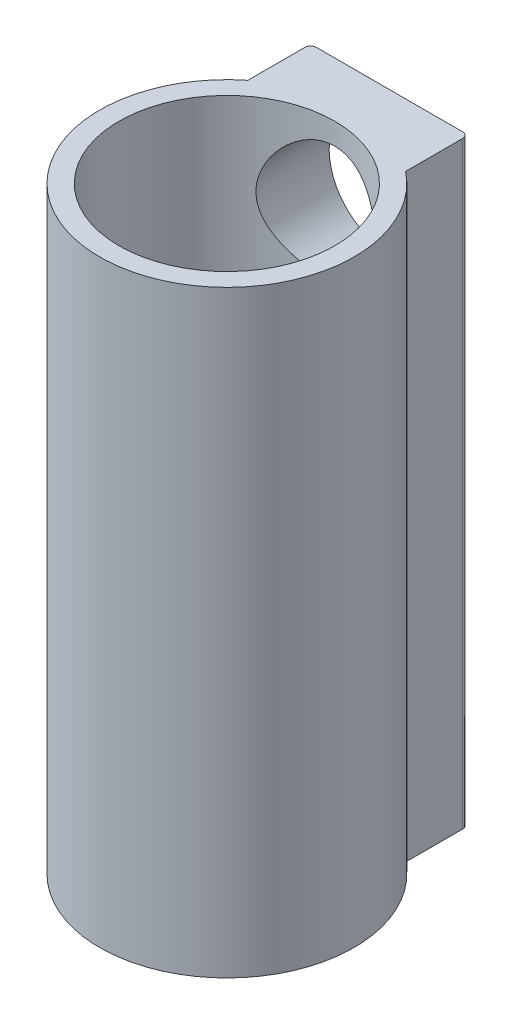
ISO-10303-21;
HEADER;
FILE_DESCRIPTION(('STEP AP214'),'2;1');
FILE_NAME('part.step','',(''),(''),'','','');
FILE_SCHEMA(('AUTOMOTIVE_DESIGN { 1 0 10303 214 1 1 1 1 }'));
ENDSEC;
DATA;
#1=APPLICATION_CONTEXT('core data for automotive mechanical design processes');
#2=APPLICATION_PROTOCOL_DEFINITION('international standard','automotive_design',2000,#1);
#3=PRODUCT_CONTEXT('',#1,'mechanical');
#4=PRODUCT('Part','Part','',(#3));
#5=PRODUCT_RELATED_PRODUCT_CATEGORY('part','',(#4));
#6=PRODUCT_DEFINITION_FORMATION('','',#4);
#7=PRODUCT_DEFINITION_CONTEXT('part definition',#1,'design');
#8=PRODUCT_DEFINITION('design','',#6,#7);
#9=PRODUCT_DEFINITION_SHAPE('','',#8);
#10=(LENGTH_UNIT() NAMED_UNIT(*) SI_UNIT(.MILLI.,.METRE.));
#11=(NAMED_UNIT(*) PLANE_ANGLE_UNIT() SI_UNIT($,.RADIAN.));
#12=(NAMED_UNIT(*) SI_UNIT($,.STERADIAN.) SOLID_ANGLE_UNIT());
#13=UNCERTAINTY_MEASURE_WITH_UNIT(LENGTH_MEASURE(1.E-05),#10,'distance_accuracy_value','');
#14=(GEOMETRIC_REPRESENTATION_CONTEXT(3) GLOBAL_UNCERTAINTY_ASSIGNED_CONTEXT((#13)) GLOBAL_UNIT_ASSIGNED_CONTEXT((#10,
#11,#12)) REPRESENTATION_CONTEXT('',''));
#15=CARTESIAN_POINT('',(0.,0.,0.));
#16=DIRECTION('',(0.,0.,1.));
#17=DIRECTION('',(1.,0.,0.));
#18=AXIS2_PLACEMENT_3D('',#15,#16,#17);
#19=CARTESIAN_POINT('',(-2.45,18.57,-3.09838667696593));
#20=DIRECTION('',(1.,0.,0.));
#21=DIRECTION('',(0.,0.,-1.));
#22=AXIS2_PLACEMENT_3D('',#19,#20,#21);
#23=PLANE('',#22);
#24=DIRECTION('',(0.,0.,1.));
#25=VECTOR('',#24,1.);
#26=CARTESIAN_POINT('',(-2.45,18.57,-3.09838667696593));
#27=LINE('',#26,#25);
#28=CARTESIAN_POINT('',(-2.45,18.57,-4.87));
#29=VERTEX_POINT('',#28);
#30=CARTESIAN_POINT('',(-2.45,18.57,-3.09838667696593));
#31=VERTEX_POINT('',#30);
#32=EDGE_CURVE('E97',#29,#31,#27,.T.);
#33=ORIENTED_EDGE('',*,*,#32,.F.);
#34=DIRECTION('',(0.,-1.,0.));
#35=VECTOR('',#34,1.);
#36=CARTESIAN_POINT('',(-2.45,18.57,-4.87));
#37=LINE('',#36,#35);
#38=CARTESIAN_POINT('',(-2.45,0.,-4.87));
#39=VERTEX_POINT('',#38);
#40=EDGE_CURVE('E13',#29,#39,#37,.T.);
#41=ORIENTED_EDGE('',*,*,#40,.T.);
#42=DIRECTION('',(0.,0.,1.));
#43=VECTOR('',#42,1.);
#44=CARTESIAN_POINT('',(-2.45,0.,-3.09838667696593));
#45=LINE('',#44,#43);
#46=CARTESIAN_POINT('',(-2.45,0.,-3.09838667696593));
#47=VERTEX_POINT('',#46);
#48=EDGE_CURVE('E116',#39,#47,#45,.T.);
#49=ORIENTED_EDGE('',*,*,#48,.T.);
#50=DIRECTION('',(0.,-1.,0.));
#51=VECTOR('',#50,1.);
#52=CARTESIAN_POINT('',(-2.45,18.57,-3.09838667696593));
#53=LINE('',#52,#51);
#54=EDGE_CURVE('E110',#31,#47,#53,.T.);
#55=ORIENTED_EDGE('',*,*,#54,.F.);
#56=EDGE_LOOP('',(#33,#41,#49,#55));
#57=FACE_BOUND('',#56,.T.);
#58=ADVANCED_FACE('F44',(#57),#23,.F.);
#59=CARTESIAN_POINT('',(0.,18.57,0.));
#60=DIRECTION('',(0.,-1.,0.));
#61=DIRECTION('',(0.,0.,-1.));
#62=AXIS2_PLACEMENT_3D('',#59,#60,#61);
#63=CYLINDRICAL_SURFACE('',#62,3.95);
#64=CARTESIAN_POINT('',(0.,0.,0.));
#65=DIRECTION('',(0.,1.,0.));
#66=DIRECTION('',(0.,0.,1.));
#67=AXIS2_PLACEMENT_3D('',#64,#65,#66);
#68=CIRCLE('',#67,3.95);
#69=CARTESIAN_POINT('',(2.45,0.,-3.09838667696593));
#70=VERTEX_POINT('',#69);
#71=EDGE_CURVE('E149',#47,#70,#68,.T.);
#72=ORIENTED_EDGE('',*,*,#71,.T.);
#73=DIRECTION('',(0.,-1.,0.));
#74=VECTOR('',#73,1.);
#75=CARTESIAN_POINT('',(2.45,18.57,-3.09838667696593));
#76=LINE('',#75,#74);
#77=CARTESIAN_POINT('',(2.45,18.57,-3.09838667696593));
#78=VERTEX_POINT('',#77);
#79=EDGE_CURVE('E112',#78,#70,#76,.T.);
#80=ORIENTED_EDGE('',*,*,#79,.F.);
#81=CARTESIAN_POINT('',(0.,18.57,0.));
#82=DIRECTION('',(0.,1.,0.));
#83=DIRECTION('',(0.,0.,1.));
#84=AXIS2_PLACEMENT_3D('',#81,#82,#83);
#85=CIRCLE('',#84,3.95);
#86=EDGE_CURVE('E100',#31,#78,#85,.T.);
#87=ORIENTED_EDGE('',*,*,#86,.F.);
#88=ORIENTED_EDGE('',*,*,#54,.T.);
#89=EDGE_LOOP('',(#72,#80,#87,#88));
#90=FACE_BOUND('',#89,.T.);
#91=ADVANCED_FACE('F109',(#90),#63,.T.);
#92=CARTESIAN_POINT('',(2.45,18.57,-3.09838667696593));
#93=DIRECTION('',(-1.,0.,0.));
#94=DIRECTION('',(0.,0.,1.));
#95=AXIS2_PLACEMENT_3D('',#92,#93,#94);
#96=PLANE('',#95);
#97=DIRECTION('',(0.,0.,-1.));
#98=VECTOR('',#97,1.);
#99=CARTESIAN_POINT('',(2.45,0.,-3.09838667696593));
#100=LINE('',#99,#98);
#101=CARTESIAN_POINT('',(2.45,0.,-4.87));
#102=VERTEX_POINT('',#101);
#103=EDGE_CURVE('E147',#70,#102,#100,.T.);
#104=ORIENTED_EDGE('',*,*,#103,.T.);
#105=DIRECTION('',(0.,-1.,0.));
#106=VECTOR('',#105,1.);
#107=CARTESIAN_POINT('',(2.45,18.57,-4.87));
#108=LINE('',#107,#106);
#109=CARTESIAN_POINT('',(2.45,18.57,-4.87));
#110=VERTEX_POINT('',#109);
#111=EDGE_CURVE('E67',#102,#110,#108,.F.);
#112=ORIENTED_EDGE('',*,*,#111,.T.);
#113=DIRECTION('',(0.,0.,-1.));
#114=VECTOR('',#113,1.);
#115=CARTESIAN_POINT('',(2.45,18.57,-3.09838667696593));
#116=LINE('',#115,#114);
#117=EDGE_CURVE('E113',#78,#110,#116,.T.);
#118=ORIENTED_EDGE('',*,*,#117,.F.);
#119=ORIENTED_EDGE('',*,*,#79,.T.);
#120=EDGE_LOOP('',(#104,#112,#118,#119));
#121=FACE_BOUND('',#120,.T.);
#122=ADVANCED_FACE('F148',(#121),#96,.F.);
#123=CARTESIAN_POINT('',(2.45,18.57,-5.05));
#124=DIRECTION('',(0.,0.,1.));
#125=DIRECTION('',(1.,0.,0.));
#126=AXIS2_PLACEMENT_3D('',#123,#124,#125);
#127=PLANE('',#126);
#128=CARTESIAN_POINT('',(0.,16.025,-5.05));
#129=DIRECTION('',(0.,0.,-1.));
#130=DIRECTION('',(-1.,0.,0.));
#131=AXIS2_PLACEMENT_3D('',#128,#129,#130);
#132=CIRCLE('',#131,1.875);
#133=CARTESIAN_POINT('',(-1.875,16.025,-5.05));
#134=VERTEX_POINT('',#133);
#135=EDGE_CURVE('E170',#134,#134,#132,.T.);
#136=ORIENTED_EDGE('',*,*,#135,.F.);
#137=EDGE_LOOP('',(#136));
#138=FACE_BOUND('',#137,.T.);
#139=CARTESIAN_POINT('',(0.,3.075,-5.05));
#140=DIRECTION('',(0.,0.,-1.));
#141=DIRECTION('',(-1.,0.,0.));
#142=AXIS2_PLACEMENT_3D('',#139,#140,#141);
#143=CIRCLE('',#142,1.875);
#144=CARTESIAN_POINT('',(-1.875,3.075,-5.05));
#145=VERTEX_POINT('',#144);
#146=EDGE_CURVE('E171',#145,#145,#143,.T.);
#147=ORIENTED_EDGE('',*,*,#146,.F.);
#148=EDGE_LOOP('',(#147));
#149=FACE_BOUND('',#148,.T.);
#150=DIRECTION('',(-1.,0.,0.));
#151=VECTOR('',#150,1.);
#152=CARTESIAN_POINT('',(2.45,18.57,-5.05));
#153=LINE('',#152,#151);
#154=CARTESIAN_POINT('',(2.27,18.57,-5.05));
#155=VERTEX_POINT('',#154);
#156=CARTESIAN_POINT('',(-2.27,18.57,-5.05));
#157=VERTEX_POINT('',#156);
#158=EDGE_CURVE('E122',#155,#157,#153,.T.);
#159=ORIENTED_EDGE('',*,*,#158,.F.);
#160=DIRECTION('',(0.,-1.,0.));
#161=VECTOR('',#160,1.);
#162=CARTESIAN_POINT('',(2.27,18.57,-5.05));
#163=LINE('',#162,#161);
#164=CARTESIAN_POINT('',(2.27,0.,-5.05));
#165=VERTEX_POINT('',#164);
#166=EDGE_CURVE('E120',#155,#165,#163,.T.);
#167=ORIENTED_EDGE('',*,*,#166,.T.);
#168=DIRECTION('',(-1.,0.,0.));
#169=VECTOR('',#168,1.);
#170=CARTESIAN_POINT('',(2.45,0.,-5.05));
#171=LINE('',#170,#169);
#172=CARTESIAN_POINT('',(-2.27,0.,-5.05));
#173=VERTEX_POINT('',#172);
#174=EDGE_CURVE('E105',#165,#173,#171,.T.);
#175=ORIENTED_EDGE('',*,*,#174,.T.);
#176=DIRECTION('',(0.,-1.,0.));
#177=VECTOR('',#176,1.);
#178=CARTESIAN_POINT('',(-2.27,18.57,-5.05));
#179=LINE('',#178,#177);
#180=EDGE_CURVE('E118',#173,#157,#179,.F.);
#181=ORIENTED_EDGE('',*,*,#180,.T.);
#182=EDGE_LOOP('',(#159,#167,#175,#181));
#183=FACE_BOUND('',#182,.T.);
#184=ADVANCED_FACE('F138',(#138,#149,#183),#127,.F.);
#185=CARTESIAN_POINT('',(0.,18.57,0.));
#186=DIRECTION('',(0.,1.,0.));
#187=DIRECTION('',(0.,0.,1.));
#188=AXIS2_PLACEMENT_3D('',#185,#186,#187);
#189=PLANE('',#188);
#190=CARTESIAN_POINT('',(0.,18.57,0.));
#191=DIRECTION('',(0.,-1.,0.));
#192=DIRECTION('',(0.,0.,-1.));
#193=AXIS2_PLACEMENT_3D('',#190,#191,#192);
#194=CIRCLE('',#193,3.35);
#195=CARTESIAN_POINT('',(0.,18.57,-3.35));
#196=VERTEX_POINT('',#195);
#197=EDGE_CURVE('E153',#196,#196,#194,.T.);
#198=ORIENTED_EDGE('',*,*,#197,.T.);
#199=EDGE_LOOP('',(#198));
#200=FACE_BOUND('',#199,.T.);
#201=ORIENTED_EDGE('',*,*,#117,.T.);
#202=CARTESIAN_POINT('',(2.27,18.57,-4.87));
#203=DIRECTION('',(0.,1.,0.));
#204=DIRECTION('',(0.,0.,1.));
#205=AXIS2_PLACEMENT_3D('',#202,#203,#204);
#206=CIRCLE('',#205,0.18);
#207=EDGE_CURVE('E52',#110,#155,#206,.T.);
#208=ORIENTED_EDGE('',*,*,#207,.T.);
#209=ORIENTED_EDGE('',*,*,#158,.T.);
#210=CARTESIAN_POINT('',(-2.27,18.57,-4.87));
#211=DIRECTION('',(0.,1.,0.));
#212=DIRECTION('',(0.,0.,1.));
#213=AXIS2_PLACEMENT_3D('',#210,#211,#212);
#214=CIRCLE('',#213,0.18);
#215=EDGE_CURVE('E59',#157,#29,#214,.T.);
#216=ORIENTED_EDGE('',*,*,#215,.T.);
#217=ORIENTED_EDGE('',*,*,#32,.T.);
#218=ORIENTED_EDGE('',*,*,#86,.T.);
#219=EDGE_LOOP('',(#201,#208,#209,#216,#217,#218));
#220=FACE_BOUND('',#219,.T.);
#221=ADVANCED_FACE('F99',(#200,#220),#189,.T.);
#222=CARTESIAN_POINT('',(0.,0.,0.));
#223=DIRECTION('',(0.,1.,0.));
#224=DIRECTION('',(0.,0.,1.));
#225=AXIS2_PLACEMENT_3D('',#222,#223,#224);
#226=PLANE('',#225);
#227=CARTESIAN_POINT('',(0.,0.,0.));
#228=DIRECTION('',(0.,-1.,0.));
#229=DIRECTION('',(0.,0.,-1.));
#230=AXIS2_PLACEMENT_3D('',#227,#228,#229);
#231=CIRCLE('',#230,3.35);
#232=CARTESIAN_POINT('',(0.,0.,-3.35));
#233=VERTEX_POINT('',#232);
#234=EDGE_CURVE('E156',#233,#233,#231,.T.);
#235=ORIENTED_EDGE('',*,*,#234,.F.);
#236=EDGE_LOOP('',(#235));
#237=FACE_BOUND('',#236,.T.);
#238=ORIENTED_EDGE('',*,*,#174,.F.);
#239=CARTESIAN_POINT('',(2.27,0.,-4.87));
#240=DIRECTION('',(0.,1.,0.));
#241=DIRECTION('',(0.,0.,1.));
#242=AXIS2_PLACEMENT_3D('',#239,#240,#241);
#243=CIRCLE('',#242,0.18);
#244=EDGE_CURVE('E130',#165,#102,#243,.F.);
#245=ORIENTED_EDGE('',*,*,#244,.T.);
#246=ORIENTED_EDGE('',*,*,#103,.F.);
#247=ORIENTED_EDGE('',*,*,#71,.F.);
#248=ORIENTED_EDGE('',*,*,#48,.F.);
#249=CARTESIAN_POINT('',(-2.27,0.,-4.87));
#250=DIRECTION('',(0.,1.,0.));
#251=DIRECTION('',(0.,0.,1.));
#252=AXIS2_PLACEMENT_3D('',#249,#250,#251);
#253=CIRCLE('',#252,0.18);
#254=EDGE_CURVE('E128',#39,#173,#253,.F.);
#255=ORIENTED_EDGE('',*,*,#254,.T.);
#256=EDGE_LOOP('',(#238,#245,#246,#247,#248,#255));
#257=FACE_BOUND('',#256,.T.);
#258=ADVANCED_FACE('F146',(#237,#257),#226,.F.);
#259=CARTESIAN_POINT('',(0.,18.57,0.));
#260=DIRECTION('',(0.,-1.,0.));
#261=DIRECTION('',(0.,0.,-1.));
#262=AXIS2_PLACEMENT_3D('',#259,#260,#261);
#263=CYLINDRICAL_SURFACE('',#262,3.35);
#264=CARTESIAN_POINT('',(-1.875,16.025,-2.7761258977215));
#265=CARTESIAN_POINT('',(-1.87499287234124,15.9292399946441,-2.77613604271632));
#266=CARTESIAN_POINT('',(-1.86761267461893,15.8334044136909,-2.78115963988623));
#267=CARTESIAN_POINT('',(-1.83854256740093,15.6448321491257,-2.80045421733537));
#268=CARTESIAN_POINT('',(-1.81682956250123,15.5521007212598,-2.81474012192323));
#269=CARTESIAN_POINT('',(-1.76042665095933,15.3728489401913,-2.85034930223412));
#270=CARTESIAN_POINT('',(-1.72582028627443,15.2862927859383,-2.87162717128924));
#271=CARTESIAN_POINT('',(-1.64487018670744,15.1202517871392,-2.91874809573255));
#272=CARTESIAN_POINT('',(-1.59852373227179,15.0407685867925,-2.94459220845604));
#273=CARTESIAN_POINT('',(-1.48972492206994,14.8819532799263,-3.00122618758486));
#274=CARTESIAN_POINT('',(-1.4260926214377,14.8035127986897,-3.03225044225055));
#275=CARTESIAN_POINT('',(-1.28696197153897,14.6576969853041,-3.09386862190123));
#276=CARTESIAN_POINT('',(-1.21145629037722,14.5903285431369,-3.12446226817974));
#277=CARTESIAN_POINT('',(-1.04246708746002,14.4626044557342,-3.18504538766868));
#278=CARTESIAN_POINT('',(-0.947977827899072,14.4034227247525,-3.21473360948961));
#279=CARTESIAN_POINT('',(-0.74840712581996,14.3022121437557,-3.26695429868513));
#280=CARTESIAN_POINT('',(-0.643334123670864,14.2601697583426,-3.28949240956049));
#281=CARTESIAN_POINT('',(-0.435088341998919,14.1982290182908,-3.32315407013514));
#282=CARTESIAN_POINT('',(-0.332521870035013,14.17674406909,-3.33508911917608));
#283=CARTESIAN_POINT('',(-0.12460917645752,14.1512227175356,-3.34929800714653));
#284=CARTESIAN_POINT('',(-0.0192652213762388,14.1471725056551,-3.35157949234683));
#285=CARTESIAN_POINT('',(0.178939956514119,14.1562118257769,-3.34652669901919));
#286=CARTESIAN_POINT('',(0.271917145503595,14.167492083642,-3.34020735374713));
#287=CARTESIAN_POINT('',(0.454404098691081,14.2035192713013,-3.32030744999151));
#288=CARTESIAN_POINT('',(0.543913594267292,14.2282672421344,-3.30672633018241));
#289=CARTESIAN_POINT('',(0.718151215104206,14.2904874529761,-3.27333395690849));
#290=CARTESIAN_POINT('',(0.802822867890616,14.3280839167729,-3.25346202532822));
#291=CARTESIAN_POINT('',(0.964810256157397,14.4146554124777,-3.20915920335101));
#292=CARTESIAN_POINT('',(1.04212370327371,14.4636339679645,-3.18472690165237));
#293=CARTESIAN_POINT('',(1.19632203331535,14.5777182599567,-3.13028957854549));
#294=CARTESIAN_POINT('',(1.27221968266143,14.644006752267,-3.09996713845928));
#295=CARTESIAN_POINT('',(1.41241235611126,14.7877398520473,-3.03866062761939));
#296=CARTESIAN_POINT('',(1.47669469801166,14.865196489615,-3.00767587448992));
#297=CARTESIAN_POINT('',(1.59781246099716,15.037714137814,-2.94525968342902));
#298=CARTESIAN_POINT('',(1.65340041284101,15.1337422557,-2.91405439715585));
#299=CARTESIAN_POINT('',(1.74727968827851,15.3357910651668,-2.85875902397525));
#300=CARTESIAN_POINT('',(1.78559105484102,15.4418000042045,-2.8346607034053));
#301=CARTESIAN_POINT('',(1.84049587872024,15.6521257480937,-2.79929862472406));
#302=CARTESIAN_POINT('',(1.8585835691843,15.7558975117307,-2.78716118283281));
#303=CARTESIAN_POINT('',(1.87700517143831,15.9656563846335,-2.7747968090415));
#304=CARTESIAN_POINT('',(1.87736147090592,16.0716405312925,-2.77455485788382));
#305=CARTESIAN_POINT('',(1.86167504125771,16.2653348705671,-2.78508716881366));
#306=CARTESIAN_POINT('',(1.84813449907688,16.3533587114852,-2.79418062254539));
#307=CARTESIAN_POINT('',(1.80908996523321,16.5256221206083,-2.81961570594117));
#308=CARTESIAN_POINT('',(1.78358033631749,16.6098598851227,-2.83596075079366));
#309=CARTESIAN_POINT('',(1.72035149716227,16.7761696228995,-2.87477151795574));
#310=CARTESIAN_POINT('',(1.68217957797378,16.8580156547221,-2.8974583475699));
#311=CARTESIAN_POINT('',(1.59508410575663,17.0146315287777,-2.94630266294992));
#312=CARTESIAN_POINT('',(1.54615536493574,17.0893979316746,-2.97246182092755));
#313=CARTESIAN_POINT('',(1.42954734509148,17.2426863620049,-3.03047826864614));
#314=CARTESIAN_POINT('',(1.36010576060986,17.3197881000428,-3.06256294177509));
#315=CARTESIAN_POINT('',(1.20908240078032,17.4618363611147,-3.12526965225309));
#316=CARTESIAN_POINT('',(1.12749289199684,17.5267750812054,-3.155890741352));
#317=CARTESIAN_POINT('',(0.94863365803335,17.6460812864739,-3.2143308878617));
#318=CARTESIAN_POINT('',(0.850739806581799,17.6996479309958,-3.24189518586643));
#319=CARTESIAN_POINT('',(0.64536125388333,17.7889828557287,-3.28893031363674));
#320=CARTESIAN_POINT('',(0.537886928643037,17.8247701219622,-3.30840977326397));
#321=CARTESIAN_POINT('',(0.328344172587634,17.8738296276856,-3.33536732019795));
#322=CARTESIAN_POINT('',(0.226864925530601,17.8890464766686,-3.34387764967024));
#323=CARTESIAN_POINT('',(0.0224527849355661,17.9026564375613,-3.35148199003504));
#324=CARTESIAN_POINT('',(-0.08047924674185,17.901059137393,-3.35058136733117));
#325=CARTESIAN_POINT('',(-0.274529021484194,17.8821109487035,-3.34001326511986));
#326=CARTESIAN_POINT('',(-0.365845450908251,17.8662599944197,-3.3311806018789));
#327=CARTESIAN_POINT('',(-0.544287309477157,17.8216182827033,-3.3067150254572));
#328=CARTESIAN_POINT('',(-0.631412253865557,17.7928260325388,-3.29108132780834));
#329=CARTESIAN_POINT('',(-0.802216072257606,17.7223173358631,-3.25374240952938));
#330=CARTESIAN_POINT('',(-0.885697159510274,17.6802188954737,-3.23185986882412));
#331=CARTESIAN_POINT('',(-1.04466557367176,17.5847771738179,-3.18403443585199));
#332=CARTESIAN_POINT('',(-1.12014979793316,17.5314295518906,-3.15808997723283));
#333=CARTESIAN_POINT('',(-1.27040330447954,17.4078389832538,-3.10093027046846));
#334=CARTESIAN_POINT('',(-1.34404763647409,17.3363476524596,-3.06945384618608));
#335=CARTESIAN_POINT('',(-1.47888007123464,17.1821699554585,-3.00681797013082));
#336=CARTESIAN_POINT('',(-1.540052203242,17.0994694584975,-2.97565897270394));
#337=CARTESIAN_POINT('',(-1.65255925655133,16.9177088831284,-2.91477840407649));
#338=CARTESIAN_POINT('',(-1.70283240520757,16.8178913168632,-2.88533345783522));
#339=CARTESIAN_POINT('',(-1.78519263240506,16.609127866611,-2.83512815565036));
#340=CARTESIAN_POINT('',(-1.81733639021256,16.5002116682877,-2.81434078679155));
#341=CARTESIAN_POINT('',(-1.85118137051215,16.3290607521256,-2.79209796549489));
#342=CARTESIAN_POINT('',(-1.86008889975787,16.268759184453,-2.78614797693979));
#343=CARTESIAN_POINT('',(-1.8720002554452,16.1473153133024,-2.77815885878835));
#344=CARTESIAN_POINT('',(-1.87500455326646,16.0861730773455,-2.77611941693079));
#345=CARTESIAN_POINT('',(-1.875,16.025,-2.7761258977215));
#346=B_SPLINE_CURVE_WITH_KNOTS('',3,(#264,#265,#266,#267,#268,#269,#270,#271,#272,#273,#274,
#275,#276,#277,#278,#279,#280,#281,#282,#283,#284,#285,#286,#287,#288,#289,#290,#291,#292,#293,
#294,#295,#296,#297,#298,#299,#300,#301,#302,#303,#304,#305,#306,#307,#308,#309,#310,#311,#312,
#313,#314,#315,#316,#317,#318,#319,#320,#321,#322,#323,#324,#325,#326,#327,#328,#329,#330,#331,
#332,#333,#334,#335,#336,#337,#338,#339,#340,#341,#342,#343,#344,#345),.UNSPECIFIED.,.T.,.F.,(4,
2,2,2,2,2,2,2,2,2,2,2,2,2,2,2,2,2,2,2,2,2,2,2,2,2,2,2,2,2,2,2,2,2,2,2,2,2,2,2,4),(0.,
0.287019578405243,0.574502783211287,0.860154762370176,1.1458729724876,1.46158240125529,
1.77748755394181,2.12177591712249,2.46579185743069,2.7803801644458,3.09471924969862,
3.37500488985358,3.65531219884951,3.93841011062371,4.221595778652,4.53600646776053,
4.85075839951227,5.1947648623367,5.53837120202622,5.85444508588683,6.17011988430658,
6.43746783252475,6.70494182404048,6.98325017547482,7.26169304486107,7.58613820764798,
7.91079080418176,8.25371851921521,8.59627924145493,8.90343782594904,9.21042126908519,
9.48845298263753,9.76651677437891,10.0534260105275,10.3404461580473,10.6611723564728,
10.9823067032846,11.3271852760873,11.6709795661231,11.8543470689637,12.0376999291082),.UNSPECIFIED.);
#347=CARTESIAN_POINT('',(-1.875,16.025,-2.7761258977215));
#348=VERTEX_POINT('',#347);
#349=EDGE_CURVE('E159',#348,#348,#346,.T.);
#350=ORIENTED_EDGE('',*,*,#349,.F.);
#351=EDGE_LOOP('',(#350));
#352=FACE_BOUND('',#351,.T.);
#353=CARTESIAN_POINT('',(-1.875,3.075,-2.7761258977215));
#354=CARTESIAN_POINT('',(-1.87499287234124,2.97923999464414,-2.77613604271632));
#355=CARTESIAN_POINT('',(-1.86761267461892,2.88340441369092,-2.78115963988623));
#356=CARTESIAN_POINT('',(-1.83854256740093,2.69483214912566,-2.80045421733538));
#357=CARTESIAN_POINT('',(-1.81682956250123,2.60210072125979,-2.81474012192323));
#358=CARTESIAN_POINT('',(-1.76042665095932,2.42284894019133,-2.85034930223412));
#359=CARTESIAN_POINT('',(-1.72582028627443,2.33629278593826,-2.87162717128924));
#360=CARTESIAN_POINT('',(-1.64487018670743,2.17025178713919,-2.91874809573256));
#361=CARTESIAN_POINT('',(-1.59852373227178,2.09076858679255,-2.94459220845604));
#362=CARTESIAN_POINT('',(-1.48972492206994,1.93195327992626,-3.00122618758486));
#363=CARTESIAN_POINT('',(-1.4260926214377,1.85351279868973,-3.03225044225055));
#364=CARTESIAN_POINT('',(-1.28696197153896,1.70769698530412,-3.09386862190123));
#365=CARTESIAN_POINT('',(-1.21145629037722,1.64032854313686,-3.12446226817974));
#366=CARTESIAN_POINT('',(-1.04246708746001,1.51260445573419,-3.18504538766868));
#367=CARTESIAN_POINT('',(-0.947977827899071,1.45342272475255,-3.21473360948961));
#368=CARTESIAN_POINT('',(-0.748407125819959,1.35221214375572,-3.26695429868514));
#369=CARTESIAN_POINT('',(-0.643334123670863,1.31016975834263,-3.28949240956049));
#370=CARTESIAN_POINT('',(-0.435088341998917,1.2482290182908,-3.32315407013514));
#371=CARTESIAN_POINT('',(-0.332521870035011,1.22674406909001,-3.33508911917608));
#372=CARTESIAN_POINT('',(-0.124609176457519,1.20122271753559,-3.34929800714653));
#373=CARTESIAN_POINT('',(-0.0192652213762379,1.19717250565514,-3.35157949234683));
#374=CARTESIAN_POINT('',(0.17893995651412,1.2062118257769,-3.34652669901919));
#375=CARTESIAN_POINT('',(0.271917145503596,1.21749208364205,-3.34020735374713));
#376=CARTESIAN_POINT('',(0.454404098691082,1.25351927130131,-3.32030744999151));
#377=CARTESIAN_POINT('',(0.543913594267292,1.27826724213439,-3.30672633018241));
#378=CARTESIAN_POINT('',(0.718151215104206,1.34048745297612,-3.27333395690849));
#379=CARTESIAN_POINT('',(0.802822867890616,1.37808391677292,-3.25346202532822));
#380=CARTESIAN_POINT('',(0.964810256157398,1.46465541247774,-3.20915920335101));
#381=CARTESIAN_POINT('',(1.04212370327371,1.51363396796447,-3.18472690165237));
#382=CARTESIAN_POINT('',(1.19632203331535,1.62771825995671,-3.13028957854549));
#383=CARTESIAN_POINT('',(1.27221968266143,1.69400675226704,-3.09996713845928));
#384=CARTESIAN_POINT('',(1.41241235611126,1.83773985204733,-3.03866062761939));
#385=CARTESIAN_POINT('',(1.47669469801165,1.91519648961503,-3.00767587448992));
#386=CARTESIAN_POINT('',(1.59781246099715,2.08771413781399,-2.94525968342903));
#387=CARTESIAN_POINT('',(1.65340041284101,2.18374225569997,-2.91405439715585));
#388=CARTESIAN_POINT('',(1.74727968827851,2.38579106516683,-2.85875902397525));
#389=CARTESIAN_POINT('',(1.78559105484102,2.49180000420449,-2.8346607034053));
#390=CARTESIAN_POINT('',(1.84049587872024,2.7021257480937,-2.79929862472406));
#391=CARTESIAN_POINT('',(1.85858356918429,2.80589751173074,-2.78716118283281));
#392=CARTESIAN_POINT('',(1.87700517143831,3.01565638463354,-2.7747968090415));
#393=CARTESIAN_POINT('',(1.87736147090592,3.12164053129251,-2.77455485788382));
#394=CARTESIAN_POINT('',(1.86167504125771,3.31533487056715,-2.78508716881366));
#395=CARTESIAN_POINT('',(1.84813449907688,3.40335871148524,-2.79418062254539));
#396=CARTESIAN_POINT('',(1.8090899652332,3.57562212060828,-2.81961570594117));
#397=CARTESIAN_POINT('',(1.78358033631749,3.65985988512275,-2.83596075079366));
#398=CARTESIAN_POINT('',(1.72035149716226,3.82616962289955,-2.87477151795574));
#399=CARTESIAN_POINT('',(1.68217957797378,3.9080156547221,-2.89745834756991));
#400=CARTESIAN_POINT('',(1.59508410575662,4.06463152877775,-2.94630266294992));
#401=CARTESIAN_POINT('',(1.54615536493574,4.13939793167461,-2.97246182092755));
#402=CARTESIAN_POINT('',(1.42954734509147,4.29268636200487,-3.03047826864615));
#403=CARTESIAN_POINT('',(1.36010576060986,4.36978810004279,-3.06256294177509));
#404=CARTESIAN_POINT('',(1.20908240078031,4.51183636111472,-3.12526965225309));
#405=CARTESIAN_POINT('',(1.12749289199683,4.57677508120537,-3.155890741352));
#406=CARTESIAN_POINT('',(0.948633658033347,4.69608128647386,-3.2143308878617));
#407=CARTESIAN_POINT('',(0.850739806581797,4.74964793099578,-3.24189518586643));
#408=CARTESIAN_POINT('',(0.645361253883329,4.8389828557287,-3.28893031363674));
#409=CARTESIAN_POINT('',(0.537886928643035,4.87477012196221,-3.30840977326397));
#410=CARTESIAN_POINT('',(0.328344172587631,4.92382962768559,-3.33536732019795));
#411=CARTESIAN_POINT('',(0.226864925530598,4.93904647666861,-3.34387764967024));
#412=CARTESIAN_POINT('',(0.0224527849355631,4.95265643756133,-3.35148199003504));
#413=CARTESIAN_POINT('',(-0.0804792467418523,4.95105913739295,-3.35058136733117));
#414=CARTESIAN_POINT('',(-0.274529021484195,4.93211094870346,-3.34001326511986));
#415=CARTESIAN_POINT('',(-0.365845450908251,4.91625999441972,-3.3311806018789));
#416=CARTESIAN_POINT('',(-0.544287309477156,4.87161828270332,-3.3067150254572));
#417=CARTESIAN_POINT('',(-0.631412253865557,4.84282603253883,-3.29108132780834));
#418=CARTESIAN_POINT('',(-0.802216072257607,4.77231733586309,-3.25374240952938));
#419=CARTESIAN_POINT('',(-0.885697159510274,4.73021889547367,-3.23185986882412));
#420=CARTESIAN_POINT('',(-1.04466557367176,4.63477717381794,-3.18403443585199));
#421=CARTESIAN_POINT('',(-1.12014979793316,4.58142955189062,-3.15808997723283));
#422=CARTESIAN_POINT('',(-1.27040330447954,4.45783898325377,-3.10093027046846));
#423=CARTESIAN_POINT('',(-1.34404763647409,4.38634765245955,-3.06945384618608));
#424=CARTESIAN_POINT('',(-1.47888007123464,4.23216995545848,-3.00681797013082));
#425=CARTESIAN_POINT('',(-1.540052203242,4.14946945849748,-2.97565897270394));
#426=CARTESIAN_POINT('',(-1.65255925655133,3.96770888312837,-2.91477840407649));
#427=CARTESIAN_POINT('',(-1.70283240520757,3.86789131686323,-2.88533345783522));
#428=CARTESIAN_POINT('',(-1.78519263240506,3.65912786661103,-2.83512815565036));
#429=CARTESIAN_POINT('',(-1.81733639021256,3.55021166828765,-2.81434078679156));
#430=CARTESIAN_POINT('',(-1.85118137051215,3.37906075212562,-2.79209796549489));
#431=CARTESIAN_POINT('',(-1.86008889975786,3.31875918445297,-2.78614797693979));
#432=CARTESIAN_POINT('',(-1.87200025544519,3.19731531330242,-2.77815885878835));
#433=CARTESIAN_POINT('',(-1.87500455326646,3.13617307734547,-2.77611941693079));
#434=CARTESIAN_POINT('',(-1.875,3.075,-2.7761258977215));
#435=B_SPLINE_CURVE_WITH_KNOTS('',3,(#353,#354,#355,#356,#357,#358,#359,#360,#361,#362,#363,
#364,#365,#366,#367,#368,#369,#370,#371,#372,#373,#374,#375,#376,#377,#378,#379,#380,#381,#382,
#383,#384,#385,#386,#387,#388,#389,#390,#391,#392,#393,#394,#395,#396,#397,#398,#399,#400,#401,
#402,#403,#404,#405,#406,#407,#408,#409,#410,#411,#412,#413,#414,#415,#416,#417,#418,#419,#420,
#421,#422,#423,#424,#425,#426,#427,#428,#429,#430,#431,#432,#433,#434),.UNSPECIFIED.,.T.,.F.,(4,
2,2,2,2,2,2,2,2,2,2,2,2,2,2,2,2,2,2,2,2,2,2,2,2,2,2,2,2,2,2,2,2,2,2,2,2,2,2,2,4),(0.,
0.287019578405241,0.574502783211286,0.860154762370174,1.1458729724876,1.46158240125529,
1.77748755394181,2.12177591712249,2.46579185743069,2.78038016444579,3.09471924969861,
3.37500488985358,3.65531219884951,3.93841011062371,4.221595778652,4.53600646776053,
4.85075839951227,5.1947648623367,5.53837120202621,5.85444508588683,6.17011988430658,
6.43746783252475,6.70494182404048,6.98325017547481,7.26169304486106,7.58613820764797,
7.91079080418176,8.2537185192152,8.59627924145492,8.90343782594903,9.21042126908518,
9.48845298263752,9.7665167743789,10.0534260105275,10.3404461580472,10.6611723564728,
10.9823067032846,11.3271852760872,11.6709795661231,11.8543470689637,12.0376999291082),.UNSPECIFIED.);
#436=CARTESIAN_POINT('',(-1.875,3.075,-2.7761258977215));
#437=VERTEX_POINT('',#436);
#438=EDGE_CURVE('E162',#437,#437,#435,.T.);
#439=ORIENTED_EDGE('',*,*,#438,.F.);
#440=EDGE_LOOP('',(#439));
#441=FACE_BOUND('',#440,.T.);
#442=ORIENTED_EDGE('',*,*,#197,.F.);
#443=EDGE_LOOP('',(#442));
#444=FACE_BOUND('',#443,.T.);
#445=ORIENTED_EDGE('',*,*,#234,.T.);
#446=EDGE_LOOP('',(#445));
#447=FACE_BOUND('',#446,.T.);
#448=ADVANCED_FACE('F200',(#352,#441,#444,#447),#263,.F.);
#449=CARTESIAN_POINT('',(0.,3.075,3.951));
#450=DIRECTION('',(0.,0.,-1.));
#451=DIRECTION('',(-1.,0.,0.));
#452=AXIS2_PLACEMENT_3D('',#449,#450,#451);
#453=CYLINDRICAL_SURFACE('',#452,1.875);
#454=ORIENTED_EDGE('',*,*,#438,.T.);
#455=EDGE_LOOP('',(#454));
#456=FACE_BOUND('',#455,.T.);
#457=ORIENTED_EDGE('',*,*,#146,.T.);
#458=EDGE_LOOP('',(#457));
#459=FACE_BOUND('',#458,.T.);
#460=ADVANCED_FACE('F173',(#456,#459),#453,.F.);
#461=CARTESIAN_POINT('',(0.,16.025,3.951));
#462=DIRECTION('',(0.,0.,-1.));
#463=DIRECTION('',(-1.,0.,0.));
#464=AXIS2_PLACEMENT_3D('',#461,#462,#463);
#465=CYLINDRICAL_SURFACE('',#464,1.875);
#466=ORIENTED_EDGE('',*,*,#349,.T.);
#467=EDGE_LOOP('',(#466));
#468=FACE_BOUND('',#467,.T.);
#469=ORIENTED_EDGE('',*,*,#135,.T.);
#470=EDGE_LOOP('',(#469));
#471=FACE_BOUND('',#470,.T.);
#472=ADVANCED_FACE('F178',(#468,#471),#465,.F.);
#473=CARTESIAN_POINT('',(2.27,18.57,-4.87));
#474=DIRECTION('',(0.,-1.,0.));
#475=DIRECTION('',(0.,0.,-1.));
#476=AXIS2_PLACEMENT_3D('',#473,#474,#475);
#477=CYLINDRICAL_SURFACE('',#476,0.18);
#478=ORIENTED_EDGE('',*,*,#207,.F.);
#479=ORIENTED_EDGE('',*,*,#111,.F.);
#480=ORIENTED_EDGE('',*,*,#244,.F.);
#481=ORIENTED_EDGE('',*,*,#166,.F.);
#482=EDGE_LOOP('',(#478,#479,#480,#481));
#483=FACE_BOUND('',#482,.T.);
#484=ADVANCED_FACE('F143',(#483),#477,.T.);
#485=CARTESIAN_POINT('',(-2.27,18.57,-4.87));
#486=DIRECTION('',(0.,-1.,0.));
#487=DIRECTION('',(0.,0.,-1.));
#488=AXIS2_PLACEMENT_3D('',#485,#486,#487);
#489=CYLINDRICAL_SURFACE('',#488,0.18);
#490=ORIENTED_EDGE('',*,*,#215,.F.);
#491=ORIENTED_EDGE('',*,*,#180,.F.);
#492=ORIENTED_EDGE('',*,*,#254,.F.);
#493=ORIENTED_EDGE('',*,*,#40,.F.);
#494=EDGE_LOOP('',(#490,#491,#492,#493));
#495=FACE_BOUND('',#494,.T.);
#496=ADVANCED_FACE('F46',(#495),#489,.T.);
#497=CLOSED_SHELL('',(#58,#91,#122,#184,#221,#258,#448,#460,#472,#484,#496));
#498=MANIFOLD_SOLID_BREP('B2',#497);
#499=ADVANCED_BREP_SHAPE_REPRESENTATION('',(#18,#498),#14);
#500=SHAPE_DEFINITION_REPRESENTATION(#9,#499);
ENDSEC;
END-ISO-10303-21;
